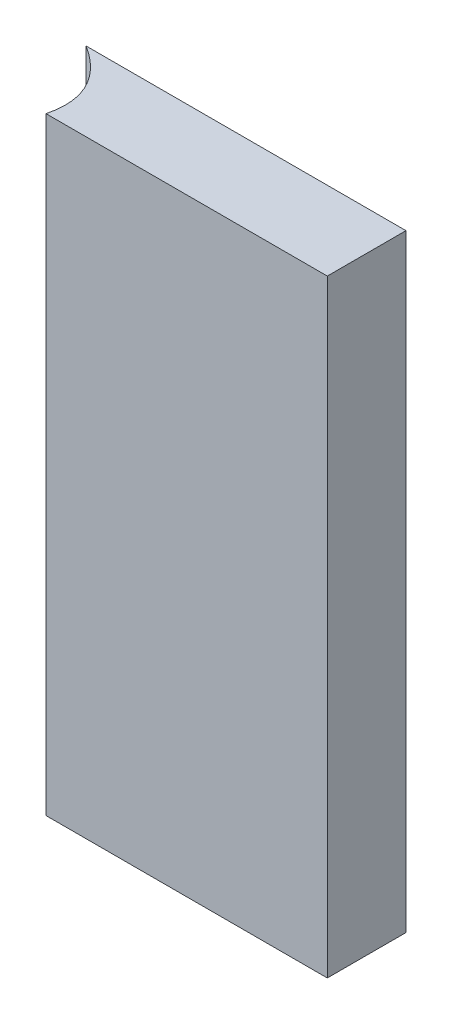
ISO-10303-21;
HEADER;
FILE_DESCRIPTION(('STEP AP214'),'2;1');
FILE_NAME('part.step','',(''),(''),'','','');
FILE_SCHEMA(('AUTOMOTIVE_DESIGN { 1 0 10303 214 1 1 1 1 }'));
ENDSEC;
DATA;
#1=APPLICATION_CONTEXT('core data for automotive mechanical design processes');
#2=APPLICATION_PROTOCOL_DEFINITION('international standard','automotive_design',2000,#1);
#3=PRODUCT_CONTEXT('',#1,'mechanical');
#4=PRODUCT('Part','Part','',(#3));
#5=PRODUCT_RELATED_PRODUCT_CATEGORY('part','',(#4));
#6=PRODUCT_DEFINITION_FORMATION('','',#4);
#7=PRODUCT_DEFINITION_CONTEXT('part definition',#1,'design');
#8=PRODUCT_DEFINITION('design','',#6,#7);
#9=PRODUCT_DEFINITION_SHAPE('','',#8);
#10=(LENGTH_UNIT() NAMED_UNIT(*) SI_UNIT(.MILLI.,.METRE.));
#11=(NAMED_UNIT(*) PLANE_ANGLE_UNIT() SI_UNIT($,.RADIAN.));
#12=(NAMED_UNIT(*) SI_UNIT($,.STERADIAN.) SOLID_ANGLE_UNIT());
#13=UNCERTAINTY_MEASURE_WITH_UNIT(LENGTH_MEASURE(1.E-05),#10,'distance_accuracy_value','');
#14=(GEOMETRIC_REPRESENTATION_CONTEXT(3) GLOBAL_UNCERTAINTY_ASSIGNED_CONTEXT((#13)) GLOBAL_UNIT_ASSIGNED_CONTEXT((#10,
#11,#12)) REPRESENTATION_CONTEXT('',''));
#15=CARTESIAN_POINT('',(0.,0.,0.));
#16=DIRECTION('',(0.,0.,1.));
#17=DIRECTION('',(1.,0.,0.));
#18=AXIS2_PLACEMENT_3D('',#15,#16,#17);
#19=CARTESIAN_POINT('',(-9.8895273624505,0.,29.2716498296639));
#20=CARTESIAN_POINT('',(32.2081101978187,0.,-0.156276991708373));
#21=CARTESIAN_POINT('',(-21.6770448247652,0.,-6.89005628353885));
#22=B_SPLINE_CURVE_WITH_KNOTS('',2,(#19,#20,#21),.UNSPECIFIED.,.F.,.F.,(3,3),(0.,1.),.UNSPECIFIED.);
#23=DIRECTION('',(0.,1.,0.));
#24=VECTOR('',#23,1.);
#25=SURFACE_OF_LINEAR_EXTRUSION('',#22,#24);
#26=DIRECTION('',(0.,1.,0.));
#27=VECTOR('',#26,1.);
#28=CARTESIAN_POINT('',(8.29260324405748,0.,10.));
#29=LINE('',#28,#27);
#30=CARTESIAN_POINT('',(8.29260324405748,-39.2569848371862,10.));
#31=VERTEX_POINT('',#30);
#32=CARTESIAN_POINT('',(8.29260324405748,38.0205443698732,10.));
#33=VERTEX_POINT('',#32);
#34=EDGE_CURVE('E11',#31,#33,#29,.T.);
#35=ORIENTED_EDGE('',*,*,#34,.T.);
#36=CARTESIAN_POINT('',(-9.8895273624505,38.0205443698732,29.2716498296639));
#37=CARTESIAN_POINT('',(32.2081101978187,38.0205443698732,-0.156276991708373));
#38=CARTESIAN_POINT('',(-21.6770448247652,38.0205443698732,-6.89005628353885));
#39=B_SPLINE_CURVE_WITH_KNOTS('',2,(#36,#37,#38),.UNSPECIFIED.,.F.,.F.,(3,3),(0.,1.),.UNSPECIFIED.);
#40=CARTESIAN_POINT('',(3.39449881879197,38.0205443698732,0.));
#41=VERTEX_POINT('',#40);
#42=EDGE_CURVE('E55',#41,#33,#39,.F.);
#43=ORIENTED_EDGE('',*,*,#42,.F.);
#44=DIRECTION('',(0.,1.,0.));
#45=VECTOR('',#44,1.);
#46=CARTESIAN_POINT('',(3.39449881879198,0.,0.));
#47=LINE('',#46,#45);
#48=CARTESIAN_POINT('',(3.39449881879197,-39.2569848371862,0.));
#49=VERTEX_POINT('',#48);
#50=EDGE_CURVE('E91',#49,#41,#47,.T.);
#51=ORIENTED_EDGE('',*,*,#50,.F.);
#52=CARTESIAN_POINT('',(-9.8895273624505,-39.2569848371862,29.2716498296639));
#53=CARTESIAN_POINT('',(32.2081101978187,-39.2569848371862,-0.156276991708373));
#54=CARTESIAN_POINT('',(-21.6770448247652,-39.2569848371862,-6.89005628353885));
#55=B_SPLINE_CURVE_WITH_KNOTS('',2,(#52,#53,#54),.UNSPECIFIED.,.F.,.F.,(3,3),(0.,1.),.UNSPECIFIED.);
#56=EDGE_CURVE('E42',#31,#49,#55,.T.);
#57=ORIENTED_EDGE('',*,*,#56,.F.);
#58=EDGE_LOOP('',(#35,#43,#51,#57));
#59=FACE_BOUND('',#58,.T.);
#60=ADVANCED_FACE('F34',(#59),#25,.F.);
#61=CARTESIAN_POINT('',(44.0481916480239,38.0205443698732,10.));
#62=DIRECTION('',(-1.,0.,0.));
#63=DIRECTION('',(0.,0.,1.));
#64=AXIS2_PLACEMENT_3D('',#61,#62,#63);
#65=PLANE('',#64);
#66=DIRECTION('',(0.,1.,0.));
#67=VECTOR('',#66,1.);
#68=CARTESIAN_POINT('',(44.0481916480239,38.0205443698732,0.));
#69=LINE('',#68,#67);
#70=CARTESIAN_POINT('',(44.0481916480239,-39.2569848371862,0.));
#71=VERTEX_POINT('',#70);
#72=CARTESIAN_POINT('',(44.0481916480239,38.0205443698732,0.));
#73=VERTEX_POINT('',#72);
#74=EDGE_CURVE('E101',#71,#73,#69,.T.);
#75=ORIENTED_EDGE('',*,*,#74,.T.);
#76=DIRECTION('',(0.,0.,-1.));
#77=VECTOR('',#76,1.);
#78=CARTESIAN_POINT('',(44.0481916480239,38.0205443698732,10.));
#79=LINE('',#78,#77);
#80=CARTESIAN_POINT('',(44.0481916480239,38.0205443698732,10.));
#81=VERTEX_POINT('',#80);
#82=EDGE_CURVE('E92',#81,#73,#79,.T.);
#83=ORIENTED_EDGE('',*,*,#82,.F.);
#84=DIRECTION('',(0.,1.,0.));
#85=VECTOR('',#84,1.);
#86=CARTESIAN_POINT('',(44.0481916480239,38.0205443698732,10.));
#87=LINE('',#86,#85);
#88=CARTESIAN_POINT('',(44.0481916480239,-39.2569848371862,10.));
#89=VERTEX_POINT('',#88);
#90=EDGE_CURVE('E79',#89,#81,#87,.T.);
#91=ORIENTED_EDGE('',*,*,#90,.F.);
#92=DIRECTION('',(0.,0.,-1.));
#93=VECTOR('',#92,1.);
#94=CARTESIAN_POINT('',(44.0481916480239,-39.2569848371862,10.));
#95=LINE('',#94,#93);
#96=EDGE_CURVE('E85',#89,#71,#95,.T.);
#97=ORIENTED_EDGE('',*,*,#96,.T.);
#98=EDGE_LOOP('',(#75,#83,#91,#97));
#99=FACE_BOUND('',#98,.T.);
#100=ADVANCED_FACE('F94',(#99),#65,.F.);
#101=CARTESIAN_POINT('',(-48.9939535172757,38.0205443698732,10.));
#102=DIRECTION('',(0.,-1.,0.));
#103=DIRECTION('',(0.,0.,-1.));
#104=AXIS2_PLACEMENT_3D('',#101,#102,#103);
#105=PLANE('',#104);
#106=DIRECTION('',(-1.,0.,0.));
#107=VECTOR('',#106,1.);
#108=CARTESIAN_POINT('',(-48.9939535172757,38.0205443698732,0.));
#109=LINE('',#108,#107);
#110=EDGE_CURVE('E82',#73,#41,#109,.T.);
#111=ORIENTED_EDGE('',*,*,#110,.T.);
#112=ORIENTED_EDGE('',*,*,#42,.T.);
#113=DIRECTION('',(-1.,0.,0.));
#114=VECTOR('',#113,1.);
#115=CARTESIAN_POINT('',(-48.9939535172757,38.0205443698732,10.));
#116=LINE('',#115,#114);
#117=EDGE_CURVE('E96',#81,#33,#116,.T.);
#118=ORIENTED_EDGE('',*,*,#117,.F.);
#119=ORIENTED_EDGE('',*,*,#82,.T.);
#120=EDGE_LOOP('',(#111,#112,#118,#119));
#121=FACE_BOUND('',#120,.T.);
#122=ADVANCED_FACE('F125',(#121),#105,.F.);
#123=CARTESIAN_POINT('',(-48.9939535172757,-39.2569848371862,10.));
#124=DIRECTION('',(0.,1.,0.));
#125=DIRECTION('',(0.,0.,1.));
#126=AXIS2_PLACEMENT_3D('',#123,#124,#125);
#127=PLANE('',#126);
#128=DIRECTION('',(1.,0.,0.));
#129=VECTOR('',#128,1.);
#130=CARTESIAN_POINT('',(-48.9939535172757,-39.2569848371862,10.));
#131=LINE('',#130,#129);
#132=EDGE_CURVE('E74',#31,#89,#131,.T.);
#133=ORIENTED_EDGE('',*,*,#132,.F.);
#134=ORIENTED_EDGE('',*,*,#56,.T.);
#135=DIRECTION('',(1.,0.,0.));
#136=VECTOR('',#135,1.);
#137=CARTESIAN_POINT('',(-48.9939535172757,-39.2569848371862,0.));
#138=LINE('',#137,#136);
#139=EDGE_CURVE('E88',#49,#71,#138,.T.);
#140=ORIENTED_EDGE('',*,*,#139,.T.);
#141=ORIENTED_EDGE('',*,*,#96,.F.);
#142=EDGE_LOOP('',(#133,#134,#140,#141));
#143=FACE_BOUND('',#142,.T.);
#144=ADVANCED_FACE('F86',(#143),#127,.F.);
#145=CARTESIAN_POINT('',(0.,0.,0.));
#146=DIRECTION('',(0.,0.,1.));
#147=DIRECTION('',(1.,0.,0.));
#148=AXIS2_PLACEMENT_3D('',#145,#146,#147);
#149=PLANE('',#148);
#150=ORIENTED_EDGE('',*,*,#139,.F.);
#151=ORIENTED_EDGE('',*,*,#50,.T.);
#152=ORIENTED_EDGE('',*,*,#110,.F.);
#153=ORIENTED_EDGE('',*,*,#74,.F.);
#154=EDGE_LOOP('',(#150,#151,#152,#153));
#155=FACE_BOUND('',#154,.T.);
#156=ADVANCED_FACE('F124',(#155),#149,.F.);
#157=CARTESIAN_POINT('',(0.,0.,10.));
#158=DIRECTION('',(0.,0.,1.));
#159=DIRECTION('',(1.,0.,0.));
#160=AXIS2_PLACEMENT_3D('',#157,#158,#159);
#161=PLANE('',#160);
#162=ORIENTED_EDGE('',*,*,#34,.F.);
#163=ORIENTED_EDGE('',*,*,#132,.T.);
#164=ORIENTED_EDGE('',*,*,#90,.T.);
#165=ORIENTED_EDGE('',*,*,#117,.T.);
#166=EDGE_LOOP('',(#162,#163,#164,#165));
#167=FACE_BOUND('',#166,.T.);
#168=ADVANCED_FACE('F76',(#167),#161,.T.);
#169=CLOSED_SHELL('',(#60,#100,#122,#144,#156,#168));
#170=MANIFOLD_SOLID_BREP('B2',#169);
#171=ADVANCED_BREP_SHAPE_REPRESENTATION('',(#18,#170),#14);
#172=SHAPE_DEFINITION_REPRESENTATION(#9,#171);
ENDSEC;
END-ISO-10303-21;
